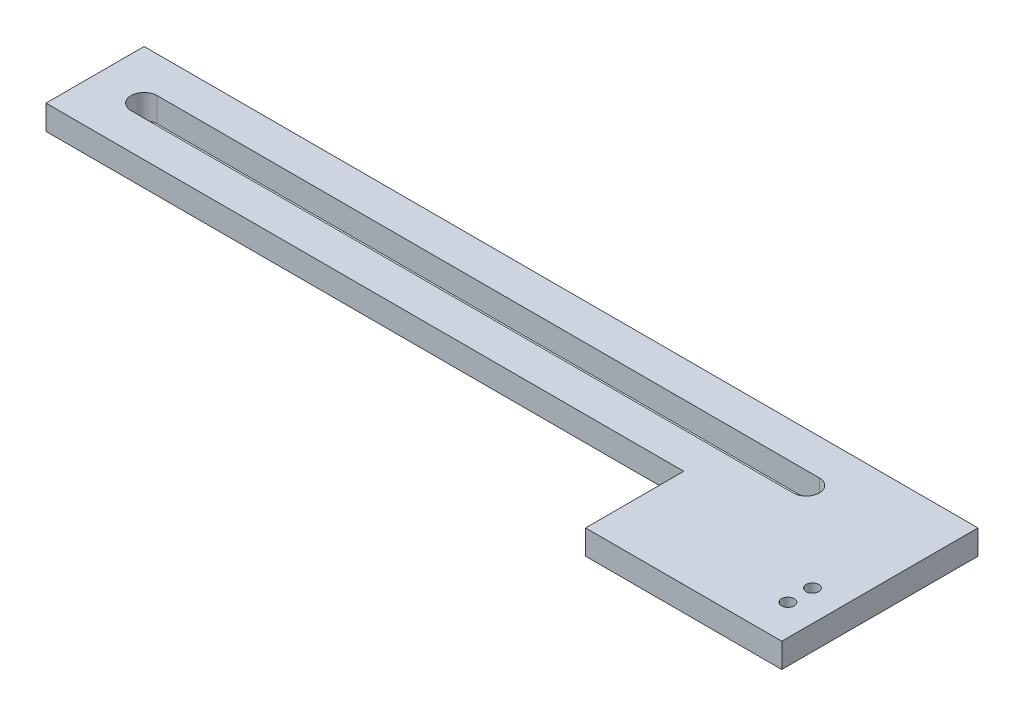
ISO-10303-21;
HEADER;
FILE_DESCRIPTION(('STEP AP214'),'2;1');
FILE_NAME('part.step','',(''),(''),'','','');
FILE_SCHEMA(('AUTOMOTIVE_DESIGN { 1 0 10303 214 1 1 1 1 }'));
ENDSEC;
DATA;
#1=APPLICATION_CONTEXT('core data for automotive mechanical design processes');
#2=APPLICATION_PROTOCOL_DEFINITION('international standard','automotive_design',2000,#1);
#3=PRODUCT_CONTEXT('',#1,'mechanical');
#4=PRODUCT('Part','Part','',(#3));
#5=PRODUCT_RELATED_PRODUCT_CATEGORY('part','',(#4));
#6=PRODUCT_DEFINITION_FORMATION('','',#4);
#7=PRODUCT_DEFINITION_CONTEXT('part definition',#1,'design');
#8=PRODUCT_DEFINITION('design','',#6,#7);
#9=PRODUCT_DEFINITION_SHAPE('','',#8);
#10=(LENGTH_UNIT() NAMED_UNIT(*) SI_UNIT(.MILLI.,.METRE.));
#11=(NAMED_UNIT(*) PLANE_ANGLE_UNIT() SI_UNIT($,.RADIAN.));
#12=(NAMED_UNIT(*) SI_UNIT($,.STERADIAN.) SOLID_ANGLE_UNIT());
#13=UNCERTAINTY_MEASURE_WITH_UNIT(LENGTH_MEASURE(1.E-05),#10,'distance_accuracy_value','');
#14=(GEOMETRIC_REPRESENTATION_CONTEXT(3) GLOBAL_UNCERTAINTY_ASSIGNED_CONTEXT((#13)) GLOBAL_UNIT_ASSIGNED_CONTEXT((#10,
#11,#12)) REPRESENTATION_CONTEXT('',''));
#15=CARTESIAN_POINT('',(0.,0.,0.));
#16=DIRECTION('',(0.,0.,1.));
#17=DIRECTION('',(1.,0.,0.));
#18=AXIS2_PLACEMENT_3D('',#15,#16,#17);
#19=CARTESIAN_POINT('',(0.,6.35,25.4));
#20=DIRECTION('',(1.,0.,0.));
#21=DIRECTION('',(0.,0.,-1.));
#22=AXIS2_PLACEMENT_3D('',#19,#20,#21);
#23=PLANE('',#22);
#24=DIRECTION('',(0.,0.,1.));
#25=VECTOR('',#24,1.);
#26=CARTESIAN_POINT('',(0.,0.,25.4));
#27=LINE('',#26,#25);
#28=CARTESIAN_POINT('',(0.,0.,0.));
#29=VERTEX_POINT('',#28);
#30=CARTESIAN_POINT('',(0.,0.,25.4));
#31=VERTEX_POINT('',#30);
#32=EDGE_CURVE('E174',#29,#31,#27,.T.);
#33=ORIENTED_EDGE('',*,*,#32,.T.);
#34=DIRECTION('',(0.,-1.,0.));
#35=VECTOR('',#34,1.);
#36=CARTESIAN_POINT('',(0.,6.35,25.4));
#37=LINE('',#36,#35);
#38=CARTESIAN_POINT('',(0.,6.35,25.4));
#39=VERTEX_POINT('',#38);
#40=EDGE_CURVE('E11',#39,#31,#37,.T.);
#41=ORIENTED_EDGE('',*,*,#40,.F.);
#42=DIRECTION('',(0.,0.,1.));
#43=VECTOR('',#42,1.);
#44=CARTESIAN_POINT('',(0.,6.35,25.4));
#45=LINE('',#44,#43);
#46=CARTESIAN_POINT('',(0.,6.35,0.));
#47=VERTEX_POINT('',#46);
#48=EDGE_CURVE('E178',#47,#39,#45,.T.);
#49=ORIENTED_EDGE('',*,*,#48,.F.);
#50=DIRECTION('',(0.,-1.,0.));
#51=VECTOR('',#50,1.);
#52=CARTESIAN_POINT('',(0.,6.35,0.));
#53=LINE('',#52,#51);
#54=EDGE_CURVE('E197',#47,#29,#53,.T.);
#55=ORIENTED_EDGE('',*,*,#54,.T.);
#56=EDGE_LOOP('',(#33,#41,#49,#55));
#57=FACE_BOUND('',#56,.T.);
#58=ADVANCED_FACE('F41',(#57),#23,.F.);
#59=CARTESIAN_POINT('',(165.1,6.35,25.4));
#60=DIRECTION('',(0.,0.,-1.));
#61=DIRECTION('',(-1.,0.,0.));
#62=AXIS2_PLACEMENT_3D('',#59,#60,#61);
#63=PLANE('',#62);
#64=DIRECTION('',(1.,0.,0.));
#65=VECTOR('',#64,1.);
#66=CARTESIAN_POINT('',(165.1,0.,25.4));
#67=LINE('',#66,#65);
#68=CARTESIAN_POINT('',(165.1,0.,25.4));
#69=VERTEX_POINT('',#68);
#70=EDGE_CURVE('E200',#31,#69,#67,.T.);
#71=ORIENTED_EDGE('',*,*,#70,.T.);
#72=DIRECTION('',(0.,-1.,0.));
#73=VECTOR('',#72,1.);
#74=CARTESIAN_POINT('',(165.1,6.35,25.4));
#75=LINE('',#74,#73);
#76=CARTESIAN_POINT('',(165.1,6.35,25.4));
#77=VERTEX_POINT('',#76);
#78=EDGE_CURVE('E48',#77,#69,#75,.T.);
#79=ORIENTED_EDGE('',*,*,#78,.F.);
#80=DIRECTION('',(1.,0.,0.));
#81=VECTOR('',#80,1.);
#82=CARTESIAN_POINT('',(165.1,6.35,25.4));
#83=LINE('',#82,#81);
#84=EDGE_CURVE('E181',#39,#77,#83,.T.);
#85=ORIENTED_EDGE('',*,*,#84,.F.);
#86=ORIENTED_EDGE('',*,*,#40,.T.);
#87=EDGE_LOOP('',(#71,#79,#85,#86));
#88=FACE_BOUND('',#87,.T.);
#89=ADVANCED_FACE('F254',(#88),#63,.F.);
#90=CARTESIAN_POINT('',(165.1,6.35,50.8));
#91=DIRECTION('',(1.,0.,0.));
#92=DIRECTION('',(0.,0.,-1.));
#93=AXIS2_PLACEMENT_3D('',#90,#91,#92);
#94=PLANE('',#93);
#95=DIRECTION('',(0.,0.,1.));
#96=VECTOR('',#95,1.);
#97=CARTESIAN_POINT('',(165.1,0.,50.8));
#98=LINE('',#97,#96);
#99=CARTESIAN_POINT('',(165.1,0.,50.8));
#100=VERTEX_POINT('',#99);
#101=EDGE_CURVE('E203',#69,#100,#98,.T.);
#102=ORIENTED_EDGE('',*,*,#101,.T.);
#103=DIRECTION('',(0.,-1.,0.));
#104=VECTOR('',#103,1.);
#105=CARTESIAN_POINT('',(165.1,6.35,50.8));
#106=LINE('',#105,#104);
#107=CARTESIAN_POINT('',(165.1,6.35,50.8));
#108=VERTEX_POINT('',#107);
#109=EDGE_CURVE('E224',#108,#100,#106,.T.);
#110=ORIENTED_EDGE('',*,*,#109,.F.);
#111=DIRECTION('',(0.,0.,1.));
#112=VECTOR('',#111,1.);
#113=CARTESIAN_POINT('',(165.1,6.35,50.8));
#114=LINE('',#113,#112);
#115=EDGE_CURVE('E185',#77,#108,#114,.T.);
#116=ORIENTED_EDGE('',*,*,#115,.F.);
#117=ORIENTED_EDGE('',*,*,#78,.T.);
#118=EDGE_LOOP('',(#102,#110,#116,#117));
#119=FACE_BOUND('',#118,.T.);
#120=ADVANCED_FACE('F233',(#119),#94,.F.);
#121=CARTESIAN_POINT('',(215.9,6.35,50.8));
#122=DIRECTION('',(0.,0.,-1.));
#123=DIRECTION('',(-1.,0.,0.));
#124=AXIS2_PLACEMENT_3D('',#121,#122,#123);
#125=PLANE('',#124);
#126=DIRECTION('',(1.,0.,0.));
#127=VECTOR('',#126,1.);
#128=CARTESIAN_POINT('',(215.9,0.,50.8));
#129=LINE('',#128,#127);
#130=CARTESIAN_POINT('',(215.9,0.,50.8));
#131=VERTEX_POINT('',#130);
#132=EDGE_CURVE('E206',#100,#131,#129,.T.);
#133=ORIENTED_EDGE('',*,*,#132,.T.);
#134=DIRECTION('',(0.,-1.,0.));
#135=VECTOR('',#134,1.);
#136=CARTESIAN_POINT('',(215.9,6.35,50.8));
#137=LINE('',#136,#135);
#138=CARTESIAN_POINT('',(215.9,6.35,50.8));
#139=VERTEX_POINT('',#138);
#140=EDGE_CURVE('E220',#139,#131,#137,.T.);
#141=ORIENTED_EDGE('',*,*,#140,.F.);
#142=DIRECTION('',(1.,0.,0.));
#143=VECTOR('',#142,1.);
#144=CARTESIAN_POINT('',(215.9,6.35,50.8));
#145=LINE('',#144,#143);
#146=EDGE_CURVE('E188',#108,#139,#145,.T.);
#147=ORIENTED_EDGE('',*,*,#146,.F.);
#148=ORIENTED_EDGE('',*,*,#109,.T.);
#149=EDGE_LOOP('',(#133,#141,#147,#148));
#150=FACE_BOUND('',#149,.T.);
#151=ADVANCED_FACE('F242',(#150),#125,.F.);
#152=CARTESIAN_POINT('',(215.9,6.35,0.));
#153=DIRECTION('',(-1.,0.,0.));
#154=DIRECTION('',(0.,0.,1.));
#155=AXIS2_PLACEMENT_3D('',#152,#153,#154);
#156=PLANE('',#155);
#157=DIRECTION('',(0.,0.,-1.));
#158=VECTOR('',#157,1.);
#159=CARTESIAN_POINT('',(215.9,0.,0.));
#160=LINE('',#159,#158);
#161=CARTESIAN_POINT('',(215.9,0.,0.));
#162=VERTEX_POINT('',#161);
#163=EDGE_CURVE('E209',#131,#162,#160,.T.);
#164=ORIENTED_EDGE('',*,*,#163,.T.);
#165=DIRECTION('',(0.,-1.,0.));
#166=VECTOR('',#165,1.);
#167=CARTESIAN_POINT('',(215.9,6.35,0.));
#168=LINE('',#167,#166);
#169=CARTESIAN_POINT('',(215.9,6.35,0.));
#170=VERTEX_POINT('',#169);
#171=EDGE_CURVE('E216',#170,#162,#168,.T.);
#172=ORIENTED_EDGE('',*,*,#171,.F.);
#173=DIRECTION('',(0.,0.,-1.));
#174=VECTOR('',#173,1.);
#175=CARTESIAN_POINT('',(215.9,6.35,0.));
#176=LINE('',#175,#174);
#177=EDGE_CURVE('E191',#139,#170,#176,.T.);
#178=ORIENTED_EDGE('',*,*,#177,.F.);
#179=ORIENTED_EDGE('',*,*,#140,.T.);
#180=EDGE_LOOP('',(#164,#172,#178,#179));
#181=FACE_BOUND('',#180,.T.);
#182=ADVANCED_FACE('F246',(#181),#156,.F.);
#183=CARTESIAN_POINT('',(0.,6.35,0.));
#184=DIRECTION('',(0.,0.,1.));
#185=DIRECTION('',(1.,0.,0.));
#186=AXIS2_PLACEMENT_3D('',#183,#184,#185);
#187=PLANE('',#186);
#188=DIRECTION('',(-1.,0.,0.));
#189=VECTOR('',#188,1.);
#190=CARTESIAN_POINT('',(0.,0.,0.));
#191=LINE('',#190,#189);
#192=EDGE_CURVE('E182',#162,#29,#191,.T.);
#193=ORIENTED_EDGE('',*,*,#192,.T.);
#194=ORIENTED_EDGE('',*,*,#54,.F.);
#195=DIRECTION('',(-1.,0.,0.));
#196=VECTOR('',#195,1.);
#197=CARTESIAN_POINT('',(0.,6.35,0.));
#198=LINE('',#197,#196);
#199=EDGE_CURVE('E194',#170,#47,#198,.T.);
#200=ORIENTED_EDGE('',*,*,#199,.F.);
#201=ORIENTED_EDGE('',*,*,#171,.T.);
#202=EDGE_LOOP('',(#193,#194,#200,#201));
#203=FACE_BOUND('',#202,.T.);
#204=ADVANCED_FACE('F257',(#203),#187,.F.);
#205=CARTESIAN_POINT('',(0.,6.35,0.));
#206=DIRECTION('',(0.,-1.,0.));
#207=DIRECTION('',(0.,0.,-1.));
#208=AXIS2_PLACEMENT_3D('',#205,#206,#207);
#209=PLANE('',#208);
#210=CARTESIAN_POINT('',(207.9625,6.35,34.9249999999997));
#211=DIRECTION('',(0.,-1.,0.));
#212=DIRECTION('',(0.,0.,-1.));
#213=AXIS2_PLACEMENT_3D('',#210,#211,#212);
#214=CIRCLE('',#213,1.63194999999999);
#215=CARTESIAN_POINT('',(207.9625,6.35,33.2930499999997));
#216=VERTEX_POINT('',#215);
#217=EDGE_CURVE('E386',#216,#216,#214,.T.);
#218=ORIENTED_EDGE('',*,*,#217,.T.);
#219=EDGE_LOOP('',(#218));
#220=FACE_BOUND('',#219,.T.);
#221=CARTESIAN_POINT('',(207.9625,6.35,41.2749999999997));
#222=DIRECTION('',(0.,-1.,0.));
#223=DIRECTION('',(0.,0.,-1.));
#224=AXIS2_PLACEMENT_3D('',#221,#222,#223);
#225=CIRCLE('',#224,1.63194999999999);
#226=CARTESIAN_POINT('',(207.9625,6.35,39.6430499999997));
#227=VERTEX_POINT('',#226);
#228=EDGE_CURVE('E158',#227,#227,#225,.T.);
#229=ORIENTED_EDGE('',*,*,#228,.T.);
#230=EDGE_LOOP('',(#229));
#231=FACE_BOUND('',#230,.T.);
#232=DIRECTION('',(-1.,0.,0.));
#233=VECTOR('',#232,1.);
#234=CARTESIAN_POINT('',(184.15,6.35,9.3218));
#235=LINE('',#234,#233);
#236=CARTESIAN_POINT('',(184.15,6.35,9.3218));
#237=VERTEX_POINT('',#236);
#238=CARTESIAN_POINT('',(12.7,6.35,9.32180000000002));
#239=VERTEX_POINT('',#238);
#240=EDGE_CURVE('E166',#237,#239,#235,.T.);
#241=ORIENTED_EDGE('',*,*,#240,.F.);
#242=CARTESIAN_POINT('',(184.15,6.35,12.7));
#243=DIRECTION('',(0.,1.,0.));
#244=DIRECTION('',(0.,0.,1.));
#245=AXIS2_PLACEMENT_3D('',#242,#243,#244);
#246=CIRCLE('',#245,3.3782);
#247=CARTESIAN_POINT('',(184.15,6.35,16.0782));
#248=VERTEX_POINT('',#247);
#249=EDGE_CURVE('E58',#248,#237,#246,.T.);
#250=ORIENTED_EDGE('',*,*,#249,.F.);
#251=DIRECTION('',(1.,0.,0.));
#252=VECTOR('',#251,1.);
#253=CARTESIAN_POINT('',(184.15,6.35,16.0782));
#254=LINE('',#253,#252);
#255=CARTESIAN_POINT('',(12.7,6.35,16.0782));
#256=VERTEX_POINT('',#255);
#257=EDGE_CURVE('E150',#256,#248,#254,.T.);
#258=ORIENTED_EDGE('',*,*,#257,.F.);
#259=CARTESIAN_POINT('',(12.7,6.35,12.7));
#260=DIRECTION('',(0.,1.,0.));
#261=DIRECTION('',(0.,0.,1.));
#262=AXIS2_PLACEMENT_3D('',#259,#260,#261);
#263=CIRCLE('',#262,3.3782);
#264=EDGE_CURVE('E155',#239,#256,#263,.T.);
#265=ORIENTED_EDGE('',*,*,#264,.F.);
#266=EDGE_LOOP('',(#241,#250,#258,#265));
#267=FACE_BOUND('',#266,.T.);
#268=ORIENTED_EDGE('',*,*,#48,.T.);
#269=ORIENTED_EDGE('',*,*,#84,.T.);
#270=ORIENTED_EDGE('',*,*,#115,.T.);
#271=ORIENTED_EDGE('',*,*,#146,.T.);
#272=ORIENTED_EDGE('',*,*,#177,.T.);
#273=ORIENTED_EDGE('',*,*,#199,.T.);
#274=EDGE_LOOP('',(#268,#269,#270,#271,#272,#273));
#275=FACE_BOUND('',#274,.T.);
#276=ADVANCED_FACE('F250',(#220,#231,#267,#275),#209,.F.);
#277=CARTESIAN_POINT('',(0.,0.,0.));
#278=DIRECTION('',(0.,-1.,0.));
#279=DIRECTION('',(0.,0.,-1.));
#280=AXIS2_PLACEMENT_3D('',#277,#278,#279);
#281=PLANE('',#280);
#282=CARTESIAN_POINT('',(207.9625,0.,34.9249999999997));
#283=DIRECTION('',(0.,-1.,0.));
#284=DIRECTION('',(0.,0.,-1.));
#285=AXIS2_PLACEMENT_3D('',#282,#283,#284);
#286=CIRCLE('',#285,2.85750000000001);
#287=CARTESIAN_POINT('',(207.9625,0.,32.0674999999997));
#288=VERTEX_POINT('',#287);
#289=EDGE_CURVE('E382',#288,#288,#286,.T.);
#290=ORIENTED_EDGE('',*,*,#289,.F.);
#291=EDGE_LOOP('',(#290));
#292=FACE_BOUND('',#291,.T.);
#293=CARTESIAN_POINT('',(207.9625,0.,41.2749999999997));
#294=DIRECTION('',(0.,-1.,0.));
#295=DIRECTION('',(0.,0.,-1.));
#296=AXIS2_PLACEMENT_3D('',#293,#294,#295);
#297=CIRCLE('',#296,2.85750000000001);
#298=CARTESIAN_POINT('',(207.9625,0.,38.4174999999997));
#299=VERTEX_POINT('',#298);
#300=EDGE_CURVE('E391',#299,#299,#297,.T.);
#301=ORIENTED_EDGE('',*,*,#300,.F.);
#302=EDGE_LOOP('',(#301));
#303=FACE_BOUND('',#302,.T.);
#304=CARTESIAN_POINT('',(184.15,0.,12.7));
#305=DIRECTION('',(0.,1.,0.));
#306=DIRECTION('',(0.,0.,1.));
#307=AXIS2_PLACEMENT_3D('',#304,#305,#306);
#308=CIRCLE('',#307,3.3782);
#309=CARTESIAN_POINT('',(184.15,0.,16.0782));
#310=VERTEX_POINT('',#309);
#311=CARTESIAN_POINT('',(184.15,0.,9.3218));
#312=VERTEX_POINT('',#311);
#313=EDGE_CURVE('E131',#310,#312,#308,.T.);
#314=ORIENTED_EDGE('',*,*,#313,.T.);
#315=DIRECTION('',(-1.,0.,0.));
#316=VECTOR('',#315,1.);
#317=CARTESIAN_POINT('',(184.15,0.,9.3218));
#318=LINE('',#317,#316);
#319=CARTESIAN_POINT('',(12.7,0.,9.32180000000002));
#320=VERTEX_POINT('',#319);
#321=EDGE_CURVE('E141',#312,#320,#318,.T.);
#322=ORIENTED_EDGE('',*,*,#321,.T.);
#323=CARTESIAN_POINT('',(12.7,0.,12.7));
#324=DIRECTION('',(0.,1.,0.));
#325=DIRECTION('',(0.,0.,1.));
#326=AXIS2_PLACEMENT_3D('',#323,#324,#325);
#327=CIRCLE('',#326,3.3782);
#328=CARTESIAN_POINT('',(12.7,0.,16.0782));
#329=VERTEX_POINT('',#328);
#330=EDGE_CURVE('E66',#320,#329,#327,.T.);
#331=ORIENTED_EDGE('',*,*,#330,.T.);
#332=DIRECTION('',(1.,0.,0.));
#333=VECTOR('',#332,1.);
#334=CARTESIAN_POINT('',(184.15,0.,16.0782));
#335=LINE('',#334,#333);
#336=EDGE_CURVE('E138',#329,#310,#335,.T.);
#337=ORIENTED_EDGE('',*,*,#336,.T.);
#338=EDGE_LOOP('',(#314,#322,#331,#337));
#339=FACE_BOUND('',#338,.T.);
#340=ORIENTED_EDGE('',*,*,#32,.F.);
#341=ORIENTED_EDGE('',*,*,#192,.F.);
#342=ORIENTED_EDGE('',*,*,#163,.F.);
#343=ORIENTED_EDGE('',*,*,#132,.F.);
#344=ORIENTED_EDGE('',*,*,#101,.F.);
#345=ORIENTED_EDGE('',*,*,#70,.F.);
#346=EDGE_LOOP('',(#340,#341,#342,#343,#344,#345));
#347=FACE_BOUND('',#346,.T.);
#348=ADVANCED_FACE('F146',(#292,#303,#339,#347),#281,.T.);
#349=CARTESIAN_POINT('',(184.15,0.,12.7));
#350=DIRECTION('',(0.,1.,0.));
#351=DIRECTION('',(0.,0.,1.));
#352=AXIS2_PLACEMENT_3D('',#349,#350,#351);
#353=CYLINDRICAL_SURFACE('',#352,3.3782);
#354=ORIENTED_EDGE('',*,*,#249,.T.);
#355=DIRECTION('',(0.,1.,0.));
#356=VECTOR('',#355,1.);
#357=CARTESIAN_POINT('',(184.15,0.,9.3218));
#358=LINE('',#357,#356);
#359=EDGE_CURVE('E127',#312,#237,#358,.T.);
#360=ORIENTED_EDGE('',*,*,#359,.F.);
#361=ORIENTED_EDGE('',*,*,#313,.F.);
#362=DIRECTION('',(0.,1.,0.));
#363=VECTOR('',#362,1.);
#364=CARTESIAN_POINT('',(184.15,0.,16.0782));
#365=LINE('',#364,#363);
#366=EDGE_CURVE('E171',#310,#248,#365,.T.);
#367=ORIENTED_EDGE('',*,*,#366,.T.);
#368=EDGE_LOOP('',(#354,#360,#361,#367));
#369=FACE_BOUND('',#368,.T.);
#370=ADVANCED_FACE('F129',(#369),#353,.F.);
#371=CARTESIAN_POINT('',(184.15,0.,16.0782));
#372=DIRECTION('',(0.,0.,1.));
#373=DIRECTION('',(1.,0.,0.));
#374=AXIS2_PLACEMENT_3D('',#371,#372,#373);
#375=PLANE('',#374);
#376=ORIENTED_EDGE('',*,*,#257,.T.);
#377=ORIENTED_EDGE('',*,*,#366,.F.);
#378=ORIENTED_EDGE('',*,*,#336,.F.);
#379=DIRECTION('',(0.,1.,0.));
#380=VECTOR('',#379,1.);
#381=CARTESIAN_POINT('',(12.7,0.,16.0782));
#382=LINE('',#381,#380);
#383=EDGE_CURVE('E175',#329,#256,#382,.T.);
#384=ORIENTED_EDGE('',*,*,#383,.T.);
#385=EDGE_LOOP('',(#376,#377,#378,#384));
#386=FACE_BOUND('',#385,.T.);
#387=ADVANCED_FACE('F326',(#386),#375,.F.);
#388=CARTESIAN_POINT('',(12.7,0.,12.7));
#389=DIRECTION('',(0.,1.,0.));
#390=DIRECTION('',(0.,0.,1.));
#391=AXIS2_PLACEMENT_3D('',#388,#389,#390);
#392=CYLINDRICAL_SURFACE('',#391,3.3782);
#393=ORIENTED_EDGE('',*,*,#264,.T.);
#394=ORIENTED_EDGE('',*,*,#383,.F.);
#395=ORIENTED_EDGE('',*,*,#330,.F.);
#396=DIRECTION('',(0.,1.,0.));
#397=VECTOR('',#396,1.);
#398=CARTESIAN_POINT('',(12.7,0.,9.32180000000002));
#399=LINE('',#398,#397);
#400=EDGE_CURVE('E137',#320,#239,#399,.T.);
#401=ORIENTED_EDGE('',*,*,#400,.T.);
#402=EDGE_LOOP('',(#393,#394,#395,#401));
#403=FACE_BOUND('',#402,.T.);
#404=ADVANCED_FACE('F337',(#403),#392,.F.);
#405=CARTESIAN_POINT('',(184.15,0.,9.3218));
#406=DIRECTION('',(0.,0.,-1.));
#407=DIRECTION('',(-1.,0.,0.));
#408=AXIS2_PLACEMENT_3D('',#405,#406,#407);
#409=PLANE('',#408);
#410=ORIENTED_EDGE('',*,*,#240,.T.);
#411=ORIENTED_EDGE('',*,*,#400,.F.);
#412=ORIENTED_EDGE('',*,*,#321,.F.);
#413=ORIENTED_EDGE('',*,*,#359,.T.);
#414=EDGE_LOOP('',(#410,#411,#412,#413));
#415=FACE_BOUND('',#414,.T.);
#416=ADVANCED_FACE('F142',(#415),#409,.F.);
#417=CARTESIAN_POINT('',(207.9625,0.,41.2749999999997));
#418=DIRECTION('',(0.,-1.,0.));
#419=DIRECTION('',(0.,0.,-1.));
#420=AXIS2_PLACEMENT_3D('',#417,#418,#419);
#421=CYLINDRICAL_SURFACE('',#420,1.63194999999999);
#422=ORIENTED_EDGE('',*,*,#228,.F.);
#423=EDGE_LOOP('',(#422));
#424=FACE_BOUND('',#423,.T.);
#425=CARTESIAN_POINT('',(207.9625,1.40983400146974,41.2749999999997));
#426=DIRECTION('',(0.,-1.,0.));
#427=DIRECTION('',(0.,0.,-1.));
#428=AXIS2_PLACEMENT_3D('',#425,#426,#427);
#429=CIRCLE('',#428,1.63194999999999);
#430=CARTESIAN_POINT('',(207.9625,1.40983400146974,39.6430499999997));
#431=VERTEX_POINT('',#430);
#432=EDGE_CURVE('E394',#431,#431,#429,.T.);
#433=ORIENTED_EDGE('',*,*,#432,.T.);
#434=EDGE_LOOP('',(#433));
#435=FACE_BOUND('',#434,.T.);
#436=ADVANCED_FACE('F286',(#424,#435),#421,.F.);
#437=CARTESIAN_POINT('',(207.9625,0.,41.2749999999997));
#438=DIRECTION('',(0.,-1.,0.));
#439=DIRECTION('',(0.,0.,-1.));
#440=AXIS2_PLACEMENT_3D('',#437,#438,#439);
#441=CONICAL_SURFACE('',#440,2.85750000000001,0.715584993317671);
#442=ORIENTED_EDGE('',*,*,#432,.F.);
#443=EDGE_LOOP('',(#442));
#444=FACE_BOUND('',#443,.T.);
#445=ORIENTED_EDGE('',*,*,#300,.T.);
#446=EDGE_LOOP('',(#445));
#447=FACE_BOUND('',#446,.T.);
#448=ADVANCED_FACE('F290',(#444,#447),#441,.F.);
#449=CARTESIAN_POINT('',(207.9625,0.,34.9249999999997));
#450=DIRECTION('',(0.,-1.,0.));
#451=DIRECTION('',(0.,0.,-1.));
#452=AXIS2_PLACEMENT_3D('',#449,#450,#451);
#453=CYLINDRICAL_SURFACE('',#452,1.63194999999999);
#454=ORIENTED_EDGE('',*,*,#217,.F.);
#455=EDGE_LOOP('',(#454));
#456=FACE_BOUND('',#455,.T.);
#457=CARTESIAN_POINT('',(207.9625,1.40983400146974,34.9249999999997));
#458=DIRECTION('',(0.,-1.,0.));
#459=DIRECTION('',(0.,0.,-1.));
#460=AXIS2_PLACEMENT_3D('',#457,#458,#459);
#461=CIRCLE('',#460,1.63194999999999);
#462=CARTESIAN_POINT('',(207.9625,1.40983400146974,33.2930499999997));
#463=VERTEX_POINT('',#462);
#464=EDGE_CURVE('E380',#463,#463,#461,.T.);
#465=ORIENTED_EDGE('',*,*,#464,.T.);
#466=EDGE_LOOP('',(#465));
#467=FACE_BOUND('',#466,.T.);
#468=ADVANCED_FACE('F299',(#456,#467),#453,.F.);
#469=CARTESIAN_POINT('',(207.9625,0.,34.9249999999997));
#470=DIRECTION('',(0.,-1.,0.));
#471=DIRECTION('',(0.,0.,-1.));
#472=AXIS2_PLACEMENT_3D('',#469,#470,#471);
#473=CONICAL_SURFACE('',#472,2.85750000000001,0.715584993317671);
#474=ORIENTED_EDGE('',*,*,#464,.F.);
#475=EDGE_LOOP('',(#474));
#476=FACE_BOUND('',#475,.T.);
#477=ORIENTED_EDGE('',*,*,#289,.T.);
#478=EDGE_LOOP('',(#477));
#479=FACE_BOUND('',#478,.T.);
#480=ADVANCED_FACE('F371',(#476,#479),#473,.F.);
#481=CLOSED_SHELL('',(#58,#89,#120,#151,#182,#204,#276,#348,#370,#387,#404,#416,#436,#448,#468,#480));
#482=MANIFOLD_SOLID_BREP('B2',#481);
#483=ADVANCED_BREP_SHAPE_REPRESENTATION('',(#18,#482),#14);
#484=SHAPE_DEFINITION_REPRESENTATION(#9,#483);
ENDSEC;
END-ISO-10303-21;
